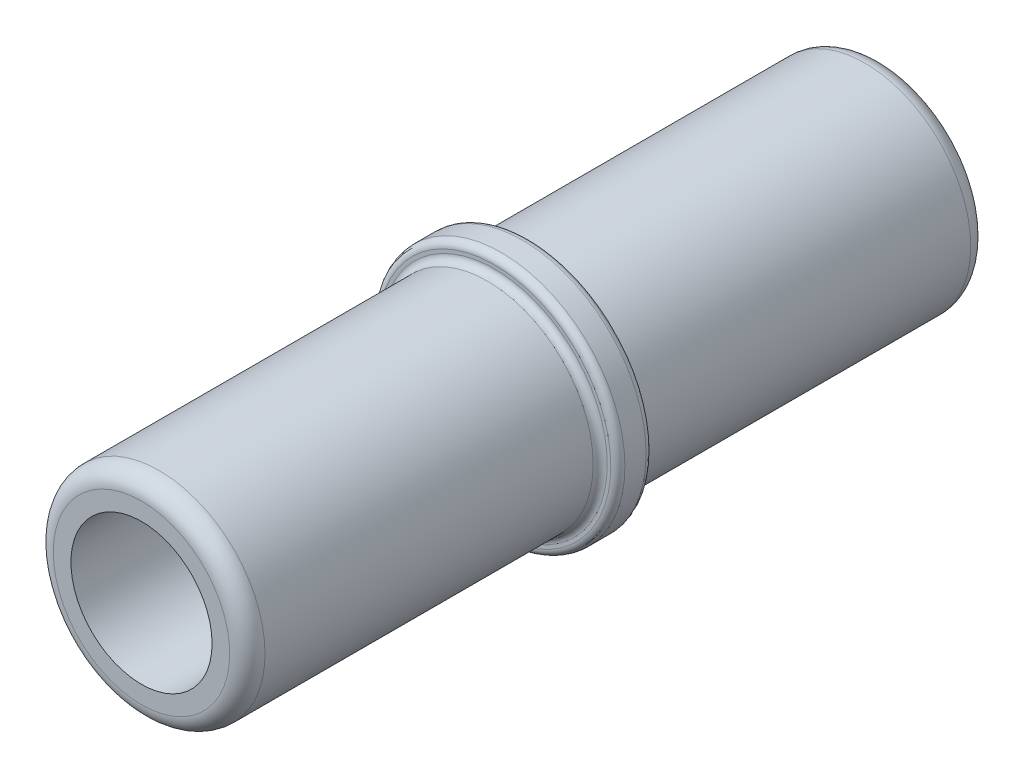
ISO-10303-21;
HEADER;
FILE_DESCRIPTION(('STEP AP214'),'2;1');
FILE_NAME('part.step','',(''),(''),'','','');
FILE_SCHEMA(('AUTOMOTIVE_DESIGN { 1 0 10303 214 1 1 1 1 }'));
ENDSEC;
DATA;
#1=APPLICATION_CONTEXT('core data for automotive mechanical design processes');
#2=APPLICATION_PROTOCOL_DEFINITION('international standard','automotive_design',2000,#1);
#3=PRODUCT_CONTEXT('',#1,'mechanical');
#4=PRODUCT('Part','Part','',(#3));
#5=PRODUCT_RELATED_PRODUCT_CATEGORY('part','',(#4));
#6=PRODUCT_DEFINITION_FORMATION('','',#4);
#7=PRODUCT_DEFINITION_CONTEXT('part definition',#1,'design');
#8=PRODUCT_DEFINITION('design','',#6,#7);
#9=PRODUCT_DEFINITION_SHAPE('','',#8);
#10=(LENGTH_UNIT() NAMED_UNIT(*) SI_UNIT(.MILLI.,.METRE.));
#11=(NAMED_UNIT(*) PLANE_ANGLE_UNIT() SI_UNIT($,.RADIAN.));
#12=(NAMED_UNIT(*) SI_UNIT($,.STERADIAN.) SOLID_ANGLE_UNIT());
#13=UNCERTAINTY_MEASURE_WITH_UNIT(LENGTH_MEASURE(1.E-05),#10,'distance_accuracy_value','');
#14=(GEOMETRIC_REPRESENTATION_CONTEXT(3) GLOBAL_UNCERTAINTY_ASSIGNED_CONTEXT((#13)) GLOBAL_UNIT_ASSIGNED_CONTEXT((#10,
#11,#12)) REPRESENTATION_CONTEXT('',''));
#15=CARTESIAN_POINT('',(0.,0.,0.));
#16=DIRECTION('',(0.,0.,1.));
#17=DIRECTION('',(1.,0.,0.));
#18=AXIS2_PLACEMENT_3D('',#15,#16,#17);
#19=CARTESIAN_POINT('',(0.,0.,0.12));
#20=DIRECTION('',(0.,0.,1.));
#21=DIRECTION('',(1.,0.,0.));
#22=AXIS2_PLACEMENT_3D('',#19,#20,#21);
#23=TOROIDAL_SURFACE('',#22,0.32,0.02);
#24=CARTESIAN_POINT('',(0.,0.,0.12));
#25=DIRECTION('',(0.,0.,1.));
#26=DIRECTION('',(1.,0.,0.));
#27=AXIS2_PLACEMENT_3D('',#24,#25,#26);
#28=CIRCLE('',#27,0.3);
#29=CARTESIAN_POINT('',(0.3,0.,0.12));
#30=VERTEX_POINT('',#29);
#31=EDGE_CURVE('E39',#30,#30,#28,.T.);
#32=ORIENTED_EDGE('',*,*,#31,.F.);
#33=EDGE_LOOP('',(#32));
#34=FACE_BOUND('',#33,.T.);
#35=CARTESIAN_POINT('',(0.,0.,0.1));
#36=DIRECTION('',(0.,0.,1.));
#37=DIRECTION('',(1.,0.,0.));
#38=AXIS2_PLACEMENT_3D('',#35,#36,#37);
#39=CIRCLE('',#38,0.32);
#40=CARTESIAN_POINT('',(0.32,0.,0.1));
#41=VERTEX_POINT('',#40);
#42=EDGE_CURVE('E10',#41,#41,#39,.F.);
#43=ORIENTED_EDGE('',*,*,#42,.F.);
#44=EDGE_LOOP('',(#43));
#45=FACE_BOUND('',#44,.T.);
#46=ADVANCED_FACE('F33',(#34,#45),#23,.F.);
#47=CARTESIAN_POINT('',(0.,0.,0.02));
#48=DIRECTION('',(0.,0.,1.));
#49=DIRECTION('',(1.,0.,0.));
#50=AXIS2_PLACEMENT_3D('',#47,#48,#49);
#51=TOROIDAL_SURFACE('',#50,0.33,0.02);
#52=CARTESIAN_POINT('',(0.,0.,0.));
#53=DIRECTION('',(0.,0.,1.));
#54=DIRECTION('',(1.,0.,0.));
#55=AXIS2_PLACEMENT_3D('',#52,#53,#54);
#56=CIRCLE('',#55,0.33);
#57=CARTESIAN_POINT('',(0.33,0.,0.));
#58=VERTEX_POINT('',#57);
#59=EDGE_CURVE('E47',#58,#58,#56,.F.);
#60=ORIENTED_EDGE('',*,*,#59,.F.);
#61=EDGE_LOOP('',(#60));
#62=FACE_BOUND('',#61,.T.);
#63=CARTESIAN_POINT('',(0.,0.,0.02));
#64=DIRECTION('',(0.,0.,1.));
#65=DIRECTION('',(1.,0.,0.));
#66=AXIS2_PLACEMENT_3D('',#63,#64,#65);
#67=CIRCLE('',#66,0.35);
#68=CARTESIAN_POINT('',(0.35,0.,0.02));
#69=VERTEX_POINT('',#68);
#70=EDGE_CURVE('E43',#69,#69,#67,.T.);
#71=ORIENTED_EDGE('',*,*,#70,.F.);
#72=EDGE_LOOP('',(#71));
#73=FACE_BOUND('',#72,.T.);
#74=ADVANCED_FACE('F118',(#62,#73),#51,.T.);
#75=CARTESIAN_POINT('',(0.,0.,-0.0200000000000001));
#76=DIRECTION('',(0.,0.,1.));
#77=DIRECTION('',(1.,0.,0.));
#78=AXIS2_PLACEMENT_3D('',#75,#76,#77);
#79=TOROIDAL_SURFACE('',#78,0.32,0.02);
#80=CARTESIAN_POINT('',(0.,0.,-0.0200000000000001));
#81=DIRECTION('',(0.,0.,1.));
#82=DIRECTION('',(1.,0.,0.));
#83=AXIS2_PLACEMENT_3D('',#80,#81,#82);
#84=CIRCLE('',#83,0.3);
#85=CARTESIAN_POINT('',(0.3,0.,-0.0200000000000001));
#86=VERTEX_POINT('',#85);
#87=EDGE_CURVE('E55',#86,#86,#84,.F.);
#88=ORIENTED_EDGE('',*,*,#87,.F.);
#89=EDGE_LOOP('',(#88));
#90=FACE_BOUND('',#89,.T.);
#91=CARTESIAN_POINT('',(0.,0.,0.));
#92=DIRECTION('',(0.,0.,1.));
#93=DIRECTION('',(1.,0.,0.));
#94=AXIS2_PLACEMENT_3D('',#91,#92,#93);
#95=CIRCLE('',#94,0.32);
#96=CARTESIAN_POINT('',(0.32,0.,0.));
#97=VERTEX_POINT('',#96);
#98=EDGE_CURVE('E52',#97,#97,#95,.T.);
#99=ORIENTED_EDGE('',*,*,#98,.F.);
#100=EDGE_LOOP('',(#99));
#101=FACE_BOUND('',#100,.T.);
#102=ADVANCED_FACE('F123',(#90,#101),#79,.F.);
#103=CARTESIAN_POINT('',(0.,0.,0.08));
#104=DIRECTION('',(0.,0.,1.));
#105=DIRECTION('',(1.,0.,0.));
#106=AXIS2_PLACEMENT_3D('',#103,#104,#105);
#107=TOROIDAL_SURFACE('',#106,0.33,0.02);
#108=CARTESIAN_POINT('',(0.,0.,0.1));
#109=DIRECTION('',(0.,0.,1.));
#110=DIRECTION('',(1.,0.,0.));
#111=AXIS2_PLACEMENT_3D('',#108,#109,#110);
#112=CIRCLE('',#111,0.33);
#113=CARTESIAN_POINT('',(0.33,0.,0.1));
#114=VERTEX_POINT('',#113);
#115=EDGE_CURVE('E61',#114,#114,#112,.T.);
#116=ORIENTED_EDGE('',*,*,#115,.F.);
#117=EDGE_LOOP('',(#116));
#118=FACE_BOUND('',#117,.T.);
#119=CARTESIAN_POINT('',(0.,0.,0.08));
#120=DIRECTION('',(0.,0.,1.));
#121=DIRECTION('',(1.,0.,0.));
#122=AXIS2_PLACEMENT_3D('',#119,#120,#121);
#123=CIRCLE('',#122,0.35);
#124=CARTESIAN_POINT('',(0.35,0.,0.08));
#125=VERTEX_POINT('',#124);
#126=EDGE_CURVE('E58',#125,#125,#123,.F.);
#127=ORIENTED_EDGE('',*,*,#126,.F.);
#128=EDGE_LOOP('',(#127));
#129=FACE_BOUND('',#128,.T.);
#130=ADVANCED_FACE('F113',(#118,#129),#107,.T.);
#131=CARTESIAN_POINT('',(0.,0.,-0.95));
#132=DIRECTION('',(0.,0.,-1.));
#133=DIRECTION('',(-1.,0.,0.));
#134=AXIS2_PLACEMENT_3D('',#131,#132,#133);
#135=TOROIDAL_SURFACE('',#134,0.25,0.05);
#136=CARTESIAN_POINT('',(0.,0.,-1.));
#137=DIRECTION('',(0.,0.,-1.));
#138=DIRECTION('',(-1.,0.,0.));
#139=AXIS2_PLACEMENT_3D('',#136,#137,#138);
#140=CIRCLE('',#139,0.25);
#141=CARTESIAN_POINT('',(-0.25,0.,-1.));
#142=VERTEX_POINT('',#141);
#143=EDGE_CURVE('E67',#142,#142,#140,.T.);
#144=ORIENTED_EDGE('',*,*,#143,.F.);
#145=EDGE_LOOP('',(#144));
#146=FACE_BOUND('',#145,.T.);
#147=CARTESIAN_POINT('',(0.,0.,-0.95));
#148=DIRECTION('',(0.,0.,-1.));
#149=DIRECTION('',(-1.,0.,0.));
#150=AXIS2_PLACEMENT_3D('',#147,#148,#149);
#151=CIRCLE('',#150,0.3);
#152=CARTESIAN_POINT('',(-0.3,0.,-0.95));
#153=VERTEX_POINT('',#152);
#154=EDGE_CURVE('E64',#153,#153,#151,.F.);
#155=ORIENTED_EDGE('',*,*,#154,.F.);
#156=EDGE_LOOP('',(#155));
#157=FACE_BOUND('',#156,.T.);
#158=ADVANCED_FACE('F103',(#146,#157),#135,.T.);
#159=CARTESIAN_POINT('',(0.,0.,1.05));
#160=DIRECTION('',(0.,0.,1.));
#161=DIRECTION('',(1.,0.,0.));
#162=AXIS2_PLACEMENT_3D('',#159,#160,#161);
#163=TOROIDAL_SURFACE('',#162,0.25,0.05);
#164=CARTESIAN_POINT('',(0.,0.,1.05));
#165=DIRECTION('',(0.,0.,1.));
#166=DIRECTION('',(1.,0.,0.));
#167=AXIS2_PLACEMENT_3D('',#164,#165,#166);
#168=CIRCLE('',#167,0.3);
#169=CARTESIAN_POINT('',(0.3,0.,1.05));
#170=VERTEX_POINT('',#169);
#171=EDGE_CURVE('E73',#170,#170,#168,.F.);
#172=ORIENTED_EDGE('',*,*,#171,.F.);
#173=EDGE_LOOP('',(#172));
#174=FACE_BOUND('',#173,.T.);
#175=CARTESIAN_POINT('',(0.,0.,1.1));
#176=DIRECTION('',(0.,0.,1.));
#177=DIRECTION('',(1.,0.,0.));
#178=AXIS2_PLACEMENT_3D('',#175,#176,#177);
#179=CIRCLE('',#178,0.25);
#180=CARTESIAN_POINT('',(0.25,0.,1.1));
#181=VERTEX_POINT('',#180);
#182=EDGE_CURVE('E70',#181,#181,#179,.T.);
#183=ORIENTED_EDGE('',*,*,#182,.F.);
#184=EDGE_LOOP('',(#183));
#185=FACE_BOUND('',#184,.T.);
#186=ADVANCED_FACE('F100',(#174,#185),#163,.T.);
#187=CARTESIAN_POINT('',(0.,0.,0.1));
#188=DIRECTION('',(0.,0.,-1.));
#189=DIRECTION('',(-1.,0.,0.));
#190=AXIS2_PLACEMENT_3D('',#187,#188,#189);
#191=CYLINDRICAL_SURFACE('',#190,0.35);
#192=ORIENTED_EDGE('',*,*,#70,.T.);
#193=EDGE_LOOP('',(#192));
#194=FACE_BOUND('',#193,.T.);
#195=ORIENTED_EDGE('',*,*,#126,.T.);
#196=EDGE_LOOP('',(#195));
#197=FACE_BOUND('',#196,.T.);
#198=ADVANCED_FACE('F102',(#194,#197),#191,.T.);
#199=CARTESIAN_POINT('',(0.,0.,0.1));
#200=DIRECTION('',(0.,0.,1.));
#201=DIRECTION('',(1.,0.,0.));
#202=AXIS2_PLACEMENT_3D('',#199,#200,#201);
#203=PLANE('',#202);
#204=ORIENTED_EDGE('',*,*,#42,.T.);
#205=EDGE_LOOP('',(#204));
#206=FACE_BOUND('',#205,.T.);
#207=ORIENTED_EDGE('',*,*,#115,.T.);
#208=EDGE_LOOP('',(#207));
#209=FACE_BOUND('',#208,.T.);
#210=ADVANCED_FACE('F110',(#206,#209),#203,.T.);
#211=CARTESIAN_POINT('',(0.,0.,0.));
#212=DIRECTION('',(0.,0.,1.));
#213=DIRECTION('',(1.,0.,0.));
#214=AXIS2_PLACEMENT_3D('',#211,#212,#213);
#215=PLANE('',#214);
#216=ORIENTED_EDGE('',*,*,#59,.T.);
#217=EDGE_LOOP('',(#216));
#218=FACE_BOUND('',#217,.T.);
#219=ORIENTED_EDGE('',*,*,#98,.T.);
#220=EDGE_LOOP('',(#219));
#221=FACE_BOUND('',#220,.T.);
#222=ADVANCED_FACE('F144',(#218,#221),#215,.F.);
#223=CARTESIAN_POINT('',(0.,0.,1.1));
#224=DIRECTION('',(0.,0.,-1.));
#225=DIRECTION('',(-1.,0.,0.));
#226=AXIS2_PLACEMENT_3D('',#223,#224,#225);
#227=CYLINDRICAL_SURFACE('',#226,0.3);
#228=ORIENTED_EDGE('',*,*,#31,.T.);
#229=EDGE_LOOP('',(#228));
#230=FACE_BOUND('',#229,.T.);
#231=ORIENTED_EDGE('',*,*,#171,.T.);
#232=EDGE_LOOP('',(#231));
#233=FACE_BOUND('',#232,.T.);
#234=ADVANCED_FACE('F96',(#230,#233),#227,.T.);
#235=CARTESIAN_POINT('',(0.,0.,1.1));
#236=DIRECTION('',(0.,0.,1.));
#237=DIRECTION('',(1.,0.,0.));
#238=AXIS2_PLACEMENT_3D('',#235,#236,#237);
#239=PLANE('',#238);
#240=CARTESIAN_POINT('',(0.,0.,1.1));
#241=DIRECTION('',(0.,0.,1.));
#242=DIRECTION('',(1.,0.,0.));
#243=AXIS2_PLACEMENT_3D('',#240,#241,#242);
#244=CIRCLE('',#243,0.2);
#245=CARTESIAN_POINT('',(0.2,0.,1.1));
#246=VERTEX_POINT('',#245);
#247=EDGE_CURVE('E77',#246,#246,#244,.T.);
#248=ORIENTED_EDGE('',*,*,#247,.F.);
#249=EDGE_LOOP('',(#248));
#250=FACE_BOUND('',#249,.T.);
#251=ORIENTED_EDGE('',*,*,#182,.T.);
#252=EDGE_LOOP('',(#251));
#253=FACE_BOUND('',#252,.T.);
#254=ADVANCED_FACE('F92',(#250,#253),#239,.T.);
#255=CARTESIAN_POINT('',(0.,0.,-1.));
#256=DIRECTION('',(0.,0.,1.));
#257=DIRECTION('',(1.,0.,0.));
#258=AXIS2_PLACEMENT_3D('',#255,#256,#257);
#259=CYLINDRICAL_SURFACE('',#258,0.3);
#260=ORIENTED_EDGE('',*,*,#87,.T.);
#261=EDGE_LOOP('',(#260));
#262=FACE_BOUND('',#261,.T.);
#263=ORIENTED_EDGE('',*,*,#154,.T.);
#264=EDGE_LOOP('',(#263));
#265=FACE_BOUND('',#264,.T.);
#266=ADVANCED_FACE('F95',(#262,#265),#259,.T.);
#267=CARTESIAN_POINT('',(0.,0.,-1.));
#268=DIRECTION('',(0.,0.,-1.));
#269=DIRECTION('',(-1.,0.,0.));
#270=AXIS2_PLACEMENT_3D('',#267,#268,#269);
#271=PLANE('',#270);
#272=CARTESIAN_POINT('',(0.,0.,-1.));
#273=DIRECTION('',(0.,0.,1.));
#274=DIRECTION('',(1.,0.,0.));
#275=AXIS2_PLACEMENT_3D('',#272,#273,#274);
#276=CIRCLE('',#275,0.2);
#277=CARTESIAN_POINT('',(0.2,0.,-1.));
#278=VERTEX_POINT('',#277);
#279=EDGE_CURVE('E76',#278,#278,#276,.T.);
#280=ORIENTED_EDGE('',*,*,#279,.T.);
#281=EDGE_LOOP('',(#280));
#282=FACE_BOUND('',#281,.T.);
#283=ORIENTED_EDGE('',*,*,#143,.T.);
#284=EDGE_LOOP('',(#283));
#285=FACE_BOUND('',#284,.T.);
#286=ADVANCED_FACE('F83',(#282,#285),#271,.T.);
#287=CARTESIAN_POINT('',(0.,0.,-1.));
#288=DIRECTION('',(0.,0.,1.));
#289=DIRECTION('',(1.,0.,0.));
#290=AXIS2_PLACEMENT_3D('',#287,#288,#289);
#291=CYLINDRICAL_SURFACE('',#290,0.2);
#292=ORIENTED_EDGE('',*,*,#279,.F.);
#293=EDGE_LOOP('',(#292));
#294=FACE_BOUND('',#293,.T.);
#295=ORIENTED_EDGE('',*,*,#247,.T.);
#296=EDGE_LOOP('',(#295));
#297=FACE_BOUND('',#296,.T.);
#298=ADVANCED_FACE('F86',(#294,#297),#291,.F.);
#299=CLOSED_SHELL('',(#46,#74,#102,#130,#158,#186,#198,#210,#222,#234,#254,#266,#286,#298));
#300=MANIFOLD_SOLID_BREP('B2',#299);
#301=ADVANCED_BREP_SHAPE_REPRESENTATION('',(#18,#300),#14);
#302=SHAPE_DEFINITION_REPRESENTATION(#9,#301);
ENDSEC;
END-ISO-10303-21;
